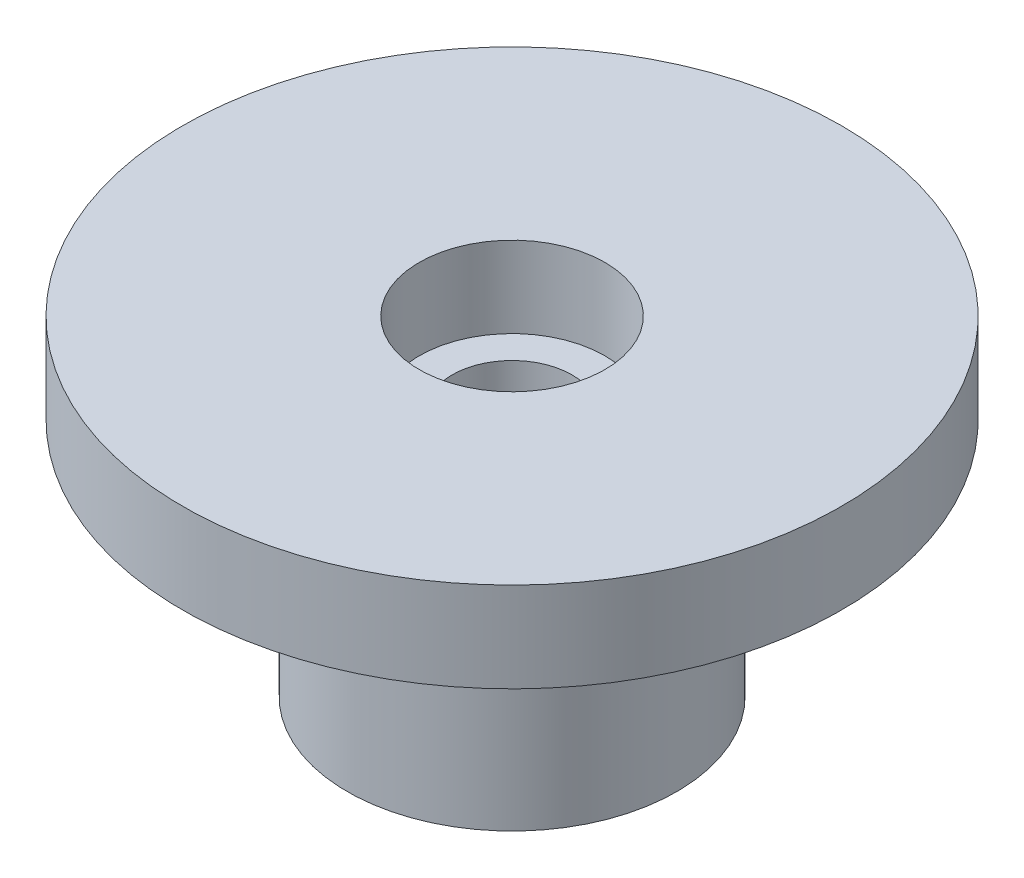
ISO-10303-21;
HEADER;
FILE_DESCRIPTION(('STEP AP214'),'2;1');
FILE_NAME('part.step','',(''),(''),'','','');
FILE_SCHEMA(('AUTOMOTIVE_DESIGN { 1 0 10303 214 1 1 1 1 }'));
ENDSEC;
DATA;
#1=APPLICATION_CONTEXT('core data for automotive mechanical design processes');
#2=APPLICATION_PROTOCOL_DEFINITION('international standard','automotive_design',2000,#1);
#3=PRODUCT_CONTEXT('',#1,'mechanical');
#4=PRODUCT('Part','Part','',(#3));
#5=PRODUCT_RELATED_PRODUCT_CATEGORY('part','',(#4));
#6=PRODUCT_DEFINITION_FORMATION('','',#4);
#7=PRODUCT_DEFINITION_CONTEXT('part definition',#1,'design');
#8=PRODUCT_DEFINITION('design','',#6,#7);
#9=PRODUCT_DEFINITION_SHAPE('','',#8);
#10=(LENGTH_UNIT() NAMED_UNIT(*) SI_UNIT(.MILLI.,.METRE.));
#11=(NAMED_UNIT(*) PLANE_ANGLE_UNIT() SI_UNIT($,.RADIAN.));
#12=(NAMED_UNIT(*) SI_UNIT($,.STERADIAN.) SOLID_ANGLE_UNIT());
#13=UNCERTAINTY_MEASURE_WITH_UNIT(LENGTH_MEASURE(1.E-05),#10,'distance_accuracy_value','');
#14=(GEOMETRIC_REPRESENTATION_CONTEXT(3) GLOBAL_UNCERTAINTY_ASSIGNED_CONTEXT((#13)) GLOBAL_UNIT_ASSIGNED_CONTEXT((#10,
#11,#12)) REPRESENTATION_CONTEXT('',''));
#15=CARTESIAN_POINT('',(0.,0.,0.));
#16=DIRECTION('',(0.,0.,1.));
#17=DIRECTION('',(1.,0.,0.));
#18=AXIS2_PLACEMENT_3D('',#15,#16,#17);
#19=CARTESIAN_POINT('',(0.,-11.,0.));
#20=DIRECTION('',(0.,1.,0.));
#21=DIRECTION('',(0.,0.,-1.));
#22=AXIS2_PLACEMENT_3D('',#19,#20,#21);
#23=CYLINDRICAL_SURFACE('',#22,2.);
#24=CARTESIAN_POINT('',(0.,0.,0.));
#25=DIRECTION('',(0.,-1.,0.));
#26=DIRECTION('',(0.,0.,-1.));
#27=AXIS2_PLACEMENT_3D('',#24,#25,#26);
#28=CIRCLE('',#27,2.);
#29=CARTESIAN_POINT('',(0.,0.,-2.));
#30=VERTEX_POINT('',#29);
#31=EDGE_CURVE('E63',#30,#30,#28,.F.);
#32=ORIENTED_EDGE('',*,*,#31,.F.);
#33=EDGE_LOOP('',(#32));
#34=FACE_BOUND('',#33,.T.);
#35=CARTESIAN_POINT('',(0.,8.3,0.));
#36=DIRECTION('',(0.,-1.,0.));
#37=DIRECTION('',(0.,0.,-1.));
#38=AXIS2_PLACEMENT_3D('',#35,#36,#37);
#39=CIRCLE('',#38,2.);
#40=CARTESIAN_POINT('',(0.,8.3,-2.));
#41=VERTEX_POINT('',#40);
#42=EDGE_CURVE('E51',#41,#41,#39,.F.);
#43=ORIENTED_EDGE('',*,*,#42,.T.);
#44=EDGE_LOOP('',(#43));
#45=FACE_BOUND('',#44,.T.);
#46=ADVANCED_FACE('F35',(#34,#45),#23,.F.);
#47=CARTESIAN_POINT('',(0.,11.,0.));
#48=DIRECTION('',(0.,-1.,0.));
#49=DIRECTION('',(0.,0.,1.));
#50=AXIS2_PLACEMENT_3D('',#47,#48,#49);
#51=CYLINDRICAL_SURFACE('',#50,11.);
#52=CARTESIAN_POINT('',(0.,8.,0.));
#53=DIRECTION('',(0.,-1.,0.));
#54=DIRECTION('',(0.,0.,-1.));
#55=AXIS2_PLACEMENT_3D('',#52,#53,#54);
#56=CIRCLE('',#55,11.);
#57=CARTESIAN_POINT('',(0.,8.,-11.));
#58=VERTEX_POINT('',#57);
#59=EDGE_CURVE('E43',#58,#58,#56,.T.);
#60=ORIENTED_EDGE('',*,*,#59,.F.);
#61=EDGE_LOOP('',(#60));
#62=FACE_BOUND('',#61,.T.);
#63=CARTESIAN_POINT('',(0.,11.,0.));
#64=DIRECTION('',(0.,-1.,0.));
#65=DIRECTION('',(0.,0.,-1.));
#66=AXIS2_PLACEMENT_3D('',#63,#64,#65);
#67=CIRCLE('',#66,11.);
#68=CARTESIAN_POINT('',(0.,11.,-11.));
#69=VERTEX_POINT('',#68);
#70=EDGE_CURVE('E10',#69,#69,#67,.T.);
#71=ORIENTED_EDGE('',*,*,#70,.T.);
#72=EDGE_LOOP('',(#71));
#73=FACE_BOUND('',#72,.T.);
#74=ADVANCED_FACE('F37',(#62,#73),#51,.T.);
#75=CARTESIAN_POINT('',(0.,11.,0.));
#76=DIRECTION('',(0.,1.,0.));
#77=DIRECTION('',(0.,0.,-1.));
#78=AXIS2_PLACEMENT_3D('',#75,#76,#77);
#79=PLANE('',#78);
#80=CARTESIAN_POINT('',(0.,11.,0.));
#81=DIRECTION('',(0.,-1.,0.));
#82=DIRECTION('',(0.,0.,-1.));
#83=AXIS2_PLACEMENT_3D('',#80,#81,#82);
#84=CIRCLE('',#83,3.1);
#85=CARTESIAN_POINT('',(0.,11.,-3.1));
#86=VERTEX_POINT('',#85);
#87=EDGE_CURVE('E58',#86,#86,#84,.T.);
#88=ORIENTED_EDGE('',*,*,#87,.T.);
#89=EDGE_LOOP('',(#88));
#90=FACE_BOUND('',#89,.T.);
#91=ORIENTED_EDGE('',*,*,#70,.F.);
#92=EDGE_LOOP('',(#91));
#93=FACE_BOUND('',#92,.T.);
#94=ADVANCED_FACE('F83',(#90,#93),#79,.T.);
#95=CARTESIAN_POINT('',(0.,8.,0.));
#96=DIRECTION('',(0.,1.,0.));
#97=DIRECTION('',(0.,0.,-1.));
#98=AXIS2_PLACEMENT_3D('',#95,#96,#97);
#99=PLANE('',#98);
#100=ORIENTED_EDGE('',*,*,#59,.T.);
#101=EDGE_LOOP('',(#100));
#102=FACE_BOUND('',#101,.T.);
#103=CARTESIAN_POINT('',(0.,8.,0.));
#104=DIRECTION('',(0.,-1.,0.));
#105=DIRECTION('',(0.,0.,-1.));
#106=AXIS2_PLACEMENT_3D('',#103,#104,#105);
#107=CIRCLE('',#106,5.5);
#108=CARTESIAN_POINT('',(0.,8.,-5.5));
#109=VERTEX_POINT('',#108);
#110=EDGE_CURVE('E48',#109,#109,#107,.T.);
#111=ORIENTED_EDGE('',*,*,#110,.F.);
#112=EDGE_LOOP('',(#111));
#113=FACE_BOUND('',#112,.T.);
#114=ADVANCED_FACE('F78',(#102,#113),#99,.F.);
#115=CARTESIAN_POINT('',(0.,8.,0.));
#116=DIRECTION('',(0.,-1.,0.));
#117=DIRECTION('',(0.,0.,1.));
#118=AXIS2_PLACEMENT_3D('',#115,#116,#117);
#119=CYLINDRICAL_SURFACE('',#118,5.5);
#120=CARTESIAN_POINT('',(0.,0.,0.));
#121=DIRECTION('',(0.,-1.,0.));
#122=DIRECTION('',(0.,0.,-1.));
#123=AXIS2_PLACEMENT_3D('',#120,#121,#122);
#124=CIRCLE('',#123,5.5);
#125=CARTESIAN_POINT('',(0.,0.,-5.5));
#126=VERTEX_POINT('',#125);
#127=EDGE_CURVE('E39',#126,#126,#124,.T.);
#128=ORIENTED_EDGE('',*,*,#127,.F.);
#129=EDGE_LOOP('',(#128));
#130=FACE_BOUND('',#129,.T.);
#131=ORIENTED_EDGE('',*,*,#110,.T.);
#132=EDGE_LOOP('',(#131));
#133=FACE_BOUND('',#132,.T.);
#134=ADVANCED_FACE('F74',(#130,#133),#119,.T.);
#135=CARTESIAN_POINT('',(0.,8.3,0.));
#136=DIRECTION('',(0.,1.,0.));
#137=DIRECTION('',(0.,0.,-1.));
#138=AXIS2_PLACEMENT_3D('',#135,#136,#137);
#139=PLANE('',#138);
#140=CARTESIAN_POINT('',(0.,8.3,0.));
#141=DIRECTION('',(0.,-1.,0.));
#142=DIRECTION('',(0.,0.,-1.));
#143=AXIS2_PLACEMENT_3D('',#140,#141,#142);
#144=CIRCLE('',#143,3.1);
#145=CARTESIAN_POINT('',(0.,8.3,-3.1));
#146=VERTEX_POINT('',#145);
#147=EDGE_CURVE('E53',#146,#146,#144,.T.);
#148=ORIENTED_EDGE('',*,*,#147,.F.);
#149=EDGE_LOOP('',(#148));
#150=FACE_BOUND('',#149,.T.);
#151=ORIENTED_EDGE('',*,*,#42,.F.);
#152=EDGE_LOOP('',(#151));
#153=FACE_BOUND('',#152,.T.);
#154=ADVANCED_FACE('F77',(#150,#153),#139,.T.);
#155=CARTESIAN_POINT('',(0.,8.3,0.));
#156=DIRECTION('',(0.,1.,0.));
#157=DIRECTION('',(0.,0.,-1.));
#158=AXIS2_PLACEMENT_3D('',#155,#156,#157);
#159=CYLINDRICAL_SURFACE('',#158,3.1);
#160=CARTESIAN_POINT('',(0.,8.3,-3.1));
#161=CARTESIAN_POINT('',(0.,8.328125,-3.1));
#162=CARTESIAN_POINT('',(0.,8.35625,-3.1));
#163=CARTESIAN_POINT('',(0.,8.4125,-3.1));
#164=CARTESIAN_POINT('',(0.,8.440625,-3.1));
#165=CARTESIAN_POINT('',(0.,8.496875,-3.1));
#166=CARTESIAN_POINT('',(0.,8.525,-3.1));
#167=CARTESIAN_POINT('',(0.,8.58125,-3.1));
#168=CARTESIAN_POINT('',(0.,8.609375,-3.1));
#169=CARTESIAN_POINT('',(0.,8.665625,-3.1));
#170=CARTESIAN_POINT('',(0.,8.69375,-3.1));
#171=CARTESIAN_POINT('',(0.,8.75,-3.1));
#172=CARTESIAN_POINT('',(0.,8.778125,-3.1));
#173=CARTESIAN_POINT('',(0.,8.834375,-3.1));
#174=CARTESIAN_POINT('',(0.,8.8625,-3.1));
#175=CARTESIAN_POINT('',(0.,8.91875,-3.1));
#176=CARTESIAN_POINT('',(0.,8.946875,-3.1));
#177=CARTESIAN_POINT('',(0.,9.003125,-3.1));
#178=CARTESIAN_POINT('',(0.,9.03125,-3.1));
#179=CARTESIAN_POINT('',(0.,9.0875,-3.1));
#180=CARTESIAN_POINT('',(0.,9.115625,-3.1));
#181=CARTESIAN_POINT('',(0.,9.171875,-3.1));
#182=CARTESIAN_POINT('',(0.,9.2,-3.1));
#183=CARTESIAN_POINT('',(0.,9.25625,-3.1));
#184=CARTESIAN_POINT('',(0.,9.284375,-3.1));
#185=CARTESIAN_POINT('',(0.,9.340625,-3.1));
#186=CARTESIAN_POINT('',(0.,9.36875,-3.1));
#187=CARTESIAN_POINT('',(0.,9.425,-3.1));
#188=CARTESIAN_POINT('',(0.,9.453125,-3.1));
#189=CARTESIAN_POINT('',(0.,9.509375,-3.1));
#190=CARTESIAN_POINT('',(0.,9.5375,-3.1));
#191=CARTESIAN_POINT('',(0.,9.59375,-3.1));
#192=CARTESIAN_POINT('',(0.,9.621875,-3.1));
#193=CARTESIAN_POINT('',(0.,9.678125,-3.1));
#194=CARTESIAN_POINT('',(0.,9.70625,-3.1));
#195=CARTESIAN_POINT('',(0.,9.7625,-3.1));
#196=CARTESIAN_POINT('',(0.,9.790625,-3.1));
#197=CARTESIAN_POINT('',(0.,9.846875,-3.1));
#198=CARTESIAN_POINT('',(0.,9.875,-3.1));
#199=CARTESIAN_POINT('',(0.,9.93125,-3.1));
#200=CARTESIAN_POINT('',(0.,9.959375,-3.1));
#201=CARTESIAN_POINT('',(0.,10.015625,-3.1));
#202=CARTESIAN_POINT('',(0.,10.04375,-3.1));
#203=CARTESIAN_POINT('',(0.,10.1,-3.1));
#204=CARTESIAN_POINT('',(0.,10.128125,-3.1));
#205=CARTESIAN_POINT('',(0.,10.184375,-3.1));
#206=CARTESIAN_POINT('',(0.,10.2125,-3.1));
#207=CARTESIAN_POINT('',(0.,10.26875,-3.1));
#208=CARTESIAN_POINT('',(0.,10.296875,-3.1));
#209=CARTESIAN_POINT('',(0.,10.353125,-3.1));
#210=CARTESIAN_POINT('',(0.,10.38125,-3.1));
#211=CARTESIAN_POINT('',(0.,10.4375,-3.1));
#212=CARTESIAN_POINT('',(0.,10.465625,-3.1));
#213=CARTESIAN_POINT('',(0.,10.521875,-3.1));
#214=CARTESIAN_POINT('',(0.,10.55,-3.1));
#215=CARTESIAN_POINT('',(0.,10.60625,-3.1));
#216=CARTESIAN_POINT('',(0.,10.634375,-3.1));
#217=CARTESIAN_POINT('',(0.,10.690625,-3.1));
#218=CARTESIAN_POINT('',(0.,10.71875,-3.1));
#219=CARTESIAN_POINT('',(0.,10.775,-3.1));
#220=CARTESIAN_POINT('',(0.,10.803125,-3.1));
#221=CARTESIAN_POINT('',(0.,10.859375,-3.1));
#222=CARTESIAN_POINT('',(0.,10.8875,-3.1));
#223=CARTESIAN_POINT('',(0.,10.94375,-3.1));
#224=CARTESIAN_POINT('',(0.,10.971875,-3.1));
#225=CARTESIAN_POINT('',(0.,11.,-3.1));
#226=B_SPLINE_CURVE_WITH_KNOTS('',3,(#160,#161,#162,#163,#164,#165,#166,#167,#168,#169,#170,
#171,#172,#173,#174,#175,#176,#177,#178,#179,#180,#181,#182,#183,#184,#185,#186,#187,#188,#189,
#190,#191,#192,#193,#194,#195,#196,#197,#198,#199,#200,#201,#202,#203,#204,#205,#206,#207,#208,
#209,#210,#211,#212,#213,#214,#215,#216,#217,#218,#219,#220,#221,#222,#223,#224,#225),
.UNSPECIFIED.,.F.,.F.,(4,2,2,2,2,2,2,2,2,2,2,2,2,2,2,2,2,2,2,2,2,2,2,2,2,2,2,2,2,2,2,2,4),(0.,
0.0843750000000011,0.168750000000001,0.253125000000002,0.337500000000001,0.421875,
0.506250000000002,0.590625000000001,0.675000000000002,0.759375000000001,0.843750000000001,
0.928125000000002,1.0125,1.096875,1.18125,1.265625,1.35,1.434375,1.51875,1.603125,1.6875,
1.771875,1.85625,1.940625,2.025,2.109375,2.19375,2.278125,2.3625,2.446875,2.53125,2.615625,2.7),.UNSPECIFIED.);
#227=EDGE_CURVE('BSEAM98',#146,#86,#226,.T.);
#228=ORIENTED_EDGE('',*,*,#147,.T.);
#229=ORIENTED_EDGE('',*,*,#87,.F.);
#230=ORIENTED_EDGE('',*,*,#227,.T.);
#231=ORIENTED_EDGE('',*,*,#227,.F.);
#232=EDGE_LOOP('',(#228,#230,#229,#231));
#233=FACE_BOUND('',#232,.T.);
#234=ADVANCED_FACE('F98',(#233),#159,.F.);
#235=CARTESIAN_POINT('',(0.,0.,0.));
#236=DIRECTION('',(0.,1.,0.));
#237=DIRECTION('',(0.,0.,-1.));
#238=AXIS2_PLACEMENT_3D('',#235,#236,#237);
#239=PLANE('',#238);
#240=ORIENTED_EDGE('',*,*,#127,.T.);
#241=EDGE_LOOP('',(#240));
#242=FACE_BOUND('',#241,.T.);
#243=ORIENTED_EDGE('',*,*,#31,.T.);
#244=EDGE_LOOP('',(#243));
#245=FACE_BOUND('',#244,.T.);
#246=ADVANCED_FACE('F72',(#242,#245),#239,.F.);
#247=CLOSED_SHELL('',(#46,#74,#94,#114,#134,#154,#234,#246));
#248=MANIFOLD_SOLID_BREP('B2',#247);
#249=ADVANCED_BREP_SHAPE_REPRESENTATION('',(#18,#248),#14);
#250=SHAPE_DEFINITION_REPRESENTATION(#9,#249);
ENDSEC;
END-ISO-10303-21;
